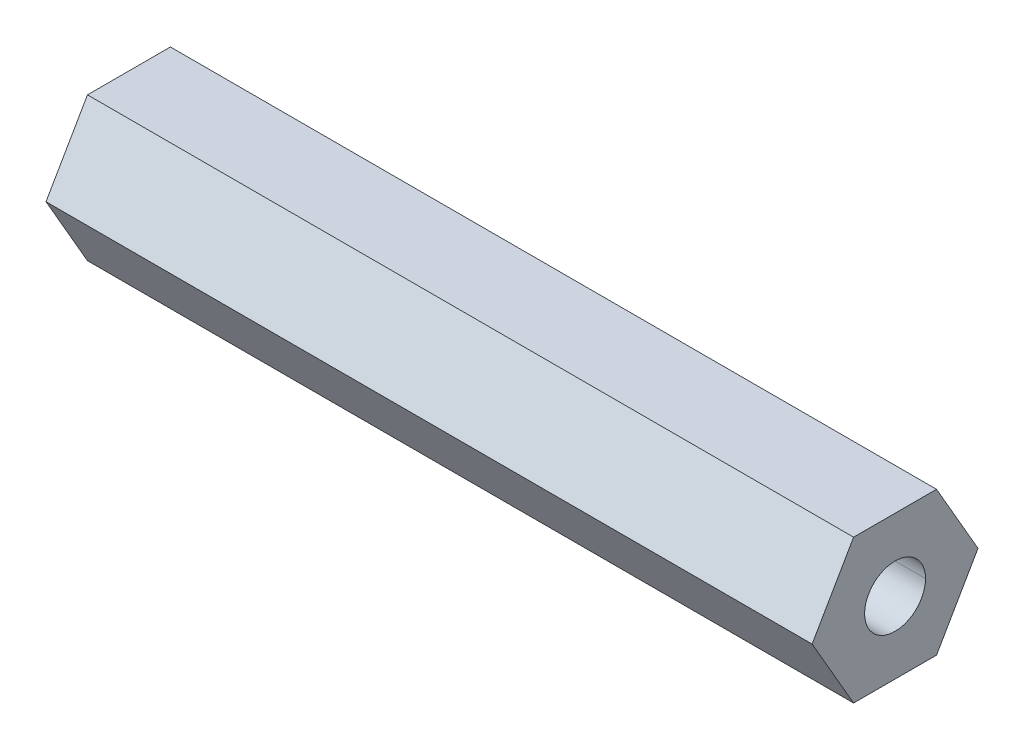
ISO-10303-21;
HEADER;
FILE_DESCRIPTION(('STEP AP214'),'2;1');
FILE_NAME('part.step','',(''),(''),'','','');
FILE_SCHEMA(('AUTOMOTIVE_DESIGN { 1 0 10303 214 1 1 1 1 }'));
ENDSEC;
DATA;
#1=APPLICATION_CONTEXT('core data for automotive mechanical design processes');
#2=APPLICATION_PROTOCOL_DEFINITION('international standard','automotive_design',2000,#1);
#3=PRODUCT_CONTEXT('',#1,'mechanical');
#4=PRODUCT('Part','Part','',(#3));
#5=PRODUCT_RELATED_PRODUCT_CATEGORY('part','',(#4));
#6=PRODUCT_DEFINITION_FORMATION('','',#4);
#7=PRODUCT_DEFINITION_CONTEXT('part definition',#1,'design');
#8=PRODUCT_DEFINITION('design','',#6,#7);
#9=PRODUCT_DEFINITION_SHAPE('','',#8);
#10=(LENGTH_UNIT() NAMED_UNIT(*) SI_UNIT(.MILLI.,.METRE.));
#11=(NAMED_UNIT(*) PLANE_ANGLE_UNIT() SI_UNIT($,.RADIAN.));
#12=(NAMED_UNIT(*) SI_UNIT($,.STERADIAN.) SOLID_ANGLE_UNIT());
#13=UNCERTAINTY_MEASURE_WITH_UNIT(LENGTH_MEASURE(1.E-05),#10,'distance_accuracy_value','');
#14=(GEOMETRIC_REPRESENTATION_CONTEXT(3) GLOBAL_UNCERTAINTY_ASSIGNED_CONTEXT((#13)) GLOBAL_UNIT_ASSIGNED_CONTEXT((#10,
#11,#12)) REPRESENTATION_CONTEXT('',''));
#15=CARTESIAN_POINT('',(0.,0.,0.));
#16=DIRECTION('',(0.,0.,1.));
#17=DIRECTION('',(1.,0.,0.));
#18=AXIS2_PLACEMENT_3D('',#15,#16,#17);
#19=CARTESIAN_POINT('',(25.4,0.,0.));
#20=DIRECTION('',(1.,0.,0.));
#21=DIRECTION('',(0.,0.,-1.));
#22=AXIS2_PLACEMENT_3D('',#19,#20,#21);
#23=CYLINDRICAL_SURFACE('',#22,2.0193);
#24=DIRECTION('',(1.,0.,0.));
#25=VECTOR('',#24,1.);
#26=CARTESIAN_POINT('',(25.4,0.,2.0193));
#27=LINE('',#26,#25);
#28=CARTESIAN_POINT('',(-25.4,0.,2.0193));
#29=VERTEX_POINT('',#28);
#30=CARTESIAN_POINT('',(25.4,0.,2.0193));
#31=VERTEX_POINT('',#30);
#32=EDGE_CURVE('E132',#29,#31,#27,.T.);
#33=ORIENTED_EDGE('',*,*,#32,.F.);
#34=CARTESIAN_POINT('',(-25.4,0.,0.));
#35=DIRECTION('',(1.,0.,0.));
#36=DIRECTION('',(0.,0.,-1.));
#37=AXIS2_PLACEMENT_3D('',#34,#35,#36);
#38=CIRCLE('',#37,2.0193);
#39=CARTESIAN_POINT('',(-25.4,0.,-2.0193));
#40=VERTEX_POINT('',#39);
#41=EDGE_CURVE('E174',#40,#29,#38,.T.);
#42=ORIENTED_EDGE('',*,*,#41,.F.);
#43=DIRECTION('',(1.,0.,0.));
#44=VECTOR('',#43,1.);
#45=CARTESIAN_POINT('',(25.4,0.,-2.0193));
#46=LINE('',#45,#44);
#47=CARTESIAN_POINT('',(25.4,0.,-2.0193));
#48=VERTEX_POINT('',#47);
#49=EDGE_CURVE('E19',#40,#48,#46,.T.);
#50=ORIENTED_EDGE('',*,*,#49,.T.);
#51=CARTESIAN_POINT('',(25.4,0.,0.));
#52=DIRECTION('',(1.,0.,0.));
#53=DIRECTION('',(0.,0.,-1.));
#54=AXIS2_PLACEMENT_3D('',#51,#52,#53);
#55=CIRCLE('',#54,2.0193);
#56=EDGE_CURVE('E122',#48,#31,#55,.T.);
#57=ORIENTED_EDGE('',*,*,#56,.T.);
#58=EDGE_LOOP('',(#33,#42,#50,#57));
#59=FACE_BOUND('',#58,.T.);
#60=ADVANCED_FACE('F16',(#59),#23,.F.);
#61=CARTESIAN_POINT('',(25.4,-4.7625,2.74963065701554));
#62=DIRECTION('',(0.,1.,0.));
#63=DIRECTION('',(0.,0.,-1.));
#64=AXIS2_PLACEMENT_3D('',#61,#62,#63);
#65=PLANE('',#64);
#66=DIRECTION('',(0.,0.,-1.));
#67=VECTOR('',#66,1.);
#68=CARTESIAN_POINT('',(-25.4,-4.7625,2.74963065701554));
#69=LINE('',#68,#67);
#70=CARTESIAN_POINT('',(-25.4,-4.7625,2.74963065701554));
#71=VERTEX_POINT('',#70);
#72=CARTESIAN_POINT('',(-25.4,-4.7625,-2.74963065701564));
#73=VERTEX_POINT('',#72);
#74=EDGE_CURVE('E99',#71,#73,#69,.T.);
#75=ORIENTED_EDGE('',*,*,#74,.T.);
#76=DIRECTION('',(-1.,0.,0.));
#77=VECTOR('',#76,1.);
#78=CARTESIAN_POINT('',(25.4,-4.7625,-2.74963065701564));
#79=LINE('',#78,#77);
#80=CARTESIAN_POINT('',(25.4,-4.7625,-2.74963065701564));
#81=VERTEX_POINT('',#80);
#82=EDGE_CURVE('E61',#81,#73,#79,.T.);
#83=ORIENTED_EDGE('',*,*,#82,.F.);
#84=DIRECTION('',(0.,0.,-1.));
#85=VECTOR('',#84,1.);
#86=CARTESIAN_POINT('',(25.4,-4.7625,2.74963065701554));
#87=LINE('',#86,#85);
#88=CARTESIAN_POINT('',(25.4,-4.7625,2.74963065701554));
#89=VERTEX_POINT('',#88);
#90=EDGE_CURVE('E102',#89,#81,#87,.T.);
#91=ORIENTED_EDGE('',*,*,#90,.F.);
#92=DIRECTION('',(-1.,0.,0.));
#93=VECTOR('',#92,1.);
#94=CARTESIAN_POINT('',(25.4,-4.7625,2.74963065701554));
#95=LINE('',#94,#93);
#96=EDGE_CURVE('E11',#89,#71,#95,.T.);
#97=ORIENTED_EDGE('',*,*,#96,.T.);
#98=EDGE_LOOP('',(#75,#83,#91,#97));
#99=FACE_BOUND('',#98,.T.);
#100=ADVANCED_FACE('F97',(#99),#65,.F.);
#101=CARTESIAN_POINT('',(25.4,0.,5.49926131403117));
#102=DIRECTION('',(0.,0.500000000000007,-0.866025403784435));
#103=DIRECTION('',(-1.,0.,0.));
#104=AXIS2_PLACEMENT_3D('',#101,#102,#103);
#105=PLANE('',#104);
#106=DIRECTION('',(0.,-0.866025403784435,-0.500000000000007));
#107=VECTOR('',#106,1.);
#108=CARTESIAN_POINT('',(-25.4,0.,5.49926131403117));
#109=LINE('',#108,#107);
#110=CARTESIAN_POINT('',(-25.4,0.,5.49926131403117));
#111=VERTEX_POINT('',#110);
#112=EDGE_CURVE('E105',#111,#71,#109,.T.);
#113=ORIENTED_EDGE('',*,*,#112,.T.);
#114=ORIENTED_EDGE('',*,*,#96,.F.);
#115=DIRECTION('',(0.,-0.866025403784435,-0.500000000000007));
#116=VECTOR('',#115,1.);
#117=CARTESIAN_POINT('',(25.4,0.,5.49926131403117));
#118=LINE('',#117,#116);
#119=CARTESIAN_POINT('',(25.4,0.,5.49926131403117));
#120=VERTEX_POINT('',#119);
#121=EDGE_CURVE('E148',#120,#89,#118,.T.);
#122=ORIENTED_EDGE('',*,*,#121,.F.);
#123=DIRECTION('',(-1.,0.,0.));
#124=VECTOR('',#123,1.);
#125=CARTESIAN_POINT('',(25.4,0.,5.49926131403117));
#126=LINE('',#125,#124);
#127=EDGE_CURVE('E26',#120,#111,#126,.T.);
#128=ORIENTED_EDGE('',*,*,#127,.T.);
#129=EDGE_LOOP('',(#113,#114,#122,#128));
#130=FACE_BOUND('',#129,.T.);
#131=ADVANCED_FACE('F106',(#130),#105,.F.);
#132=CARTESIAN_POINT('',(25.4,4.7625,2.7496306570156));
#133=DIRECTION('',(0.,-0.5,-0.866025403784442));
#134=DIRECTION('',(0.,-0.866025403784442,0.5));
#135=AXIS2_PLACEMENT_3D('',#132,#133,#134);
#136=PLANE('',#135);
#137=DIRECTION('',(0.,-0.866025403784442,0.5));
#138=VECTOR('',#137,1.);
#139=CARTESIAN_POINT('',(-25.4,4.7625,2.7496306570156));
#140=LINE('',#139,#138);
#141=CARTESIAN_POINT('',(-25.4,4.7625,2.7496306570156));
#142=VERTEX_POINT('',#141);
#143=EDGE_CURVE('E111',#142,#111,#140,.T.);
#144=ORIENTED_EDGE('',*,*,#143,.T.);
#145=ORIENTED_EDGE('',*,*,#127,.F.);
#146=DIRECTION('',(0.,-0.866025403784442,0.5));
#147=VECTOR('',#146,1.);
#148=CARTESIAN_POINT('',(25.4,4.7625,2.7496306570156));
#149=LINE('',#148,#147);
#150=CARTESIAN_POINT('',(25.4,4.7625,2.7496306570156));
#151=VERTEX_POINT('',#150);
#152=EDGE_CURVE('E156',#151,#120,#149,.T.);
#153=ORIENTED_EDGE('',*,*,#152,.F.);
#154=DIRECTION('',(-1.,0.,0.));
#155=VECTOR('',#154,1.);
#156=CARTESIAN_POINT('',(25.4,4.7625,2.7496306570156));
#157=LINE('',#156,#155);
#158=EDGE_CURVE('E133',#151,#142,#157,.T.);
#159=ORIENTED_EDGE('',*,*,#158,.T.);
#160=EDGE_LOOP('',(#144,#145,#153,#159));
#161=FACE_BOUND('',#160,.T.);
#162=ADVANCED_FACE('F197',(#161),#136,.F.);
#163=CARTESIAN_POINT('',(25.4,4.7625,-2.74963065701557));
#164=DIRECTION('',(0.,-1.,0.));
#165=DIRECTION('',(0.,0.,-1.));
#166=AXIS2_PLACEMENT_3D('',#163,#164,#165);
#167=PLANE('',#166);
#168=DIRECTION('',(0.,0.,1.));
#169=VECTOR('',#168,1.);
#170=CARTESIAN_POINT('',(-25.4,4.7625,-2.74963065701557));
#171=LINE('',#170,#169);
#172=CARTESIAN_POINT('',(-25.4,4.7625,-2.74963065701557));
#173=VERTEX_POINT('',#172);
#174=EDGE_CURVE('E170',#173,#142,#171,.T.);
#175=ORIENTED_EDGE('',*,*,#174,.T.);
#176=ORIENTED_EDGE('',*,*,#158,.F.);
#177=DIRECTION('',(0.,0.,1.));
#178=VECTOR('',#177,1.);
#179=CARTESIAN_POINT('',(25.4,4.7625,-2.74963065701557));
#180=LINE('',#179,#178);
#181=CARTESIAN_POINT('',(25.4,4.7625,-2.74963065701557));
#182=VERTEX_POINT('',#181);
#183=EDGE_CURVE('E160',#182,#151,#180,.T.);
#184=ORIENTED_EDGE('',*,*,#183,.F.);
#185=DIRECTION('',(-1.,0.,0.));
#186=VECTOR('',#185,1.);
#187=CARTESIAN_POINT('',(25.4,4.7625,-2.74963065701557));
#188=LINE('',#187,#186);
#189=EDGE_CURVE('E41',#182,#173,#188,.T.);
#190=ORIENTED_EDGE('',*,*,#189,.T.);
#191=EDGE_LOOP('',(#175,#176,#184,#190));
#192=FACE_BOUND('',#191,.T.);
#193=ADVANCED_FACE('F194',(#192),#167,.F.);
#194=CARTESIAN_POINT('',(25.4,0.,-5.49926131403117));
#195=DIRECTION('',(0.,-0.5,0.866025403784438));
#196=DIRECTION('',(-1.,0.,0.));
#197=AXIS2_PLACEMENT_3D('',#194,#195,#196);
#198=PLANE('',#197);
#199=DIRECTION('',(0.,0.866025403784438,0.5));
#200=VECTOR('',#199,1.);
#201=CARTESIAN_POINT('',(-25.4,0.,-5.49926131403117));
#202=LINE('',#201,#200);
#203=CARTESIAN_POINT('',(-25.4,0.,-5.49926131403117));
#204=VERTEX_POINT('',#203);
#205=EDGE_CURVE('E171',#204,#173,#202,.T.);
#206=ORIENTED_EDGE('',*,*,#205,.T.);
#207=ORIENTED_EDGE('',*,*,#189,.F.);
#208=DIRECTION('',(0.,0.866025403784438,0.5));
#209=VECTOR('',#208,1.);
#210=CARTESIAN_POINT('',(25.4,0.,-5.49926131403117));
#211=LINE('',#210,#209);
#212=CARTESIAN_POINT('',(25.4,0.,-5.49926131403117));
#213=VERTEX_POINT('',#212);
#214=EDGE_CURVE('E178',#213,#182,#211,.T.);
#215=ORIENTED_EDGE('',*,*,#214,.F.);
#216=DIRECTION('',(-1.,0.,0.));
#217=VECTOR('',#216,1.);
#218=CARTESIAN_POINT('',(25.4,0.,-5.49926131403117));
#219=LINE('',#218,#217);
#220=EDGE_CURVE('E176',#213,#204,#219,.T.);
#221=ORIENTED_EDGE('',*,*,#220,.T.);
#222=EDGE_LOOP('',(#206,#207,#215,#221));
#223=FACE_BOUND('',#222,.T.);
#224=ADVANCED_FACE('F278',(#223),#198,.F.);
#225=CARTESIAN_POINT('',(25.4,-4.7625,-2.74963065701564));
#226=DIRECTION('',(0.,0.5,0.866025403784442));
#227=DIRECTION('',(1.,0.,0.));
#228=AXIS2_PLACEMENT_3D('',#225,#226,#227);
#229=PLANE('',#228);
#230=DIRECTION('',(0.,0.866025403784442,-0.5));
#231=VECTOR('',#230,1.);
#232=CARTESIAN_POINT('',(-25.4,-4.7625,-2.74963065701564));
#233=LINE('',#232,#231);
#234=EDGE_CURVE('E115',#73,#204,#233,.T.);
#235=ORIENTED_EDGE('',*,*,#234,.T.);
#236=ORIENTED_EDGE('',*,*,#220,.F.);
#237=DIRECTION('',(0.,0.866025403784442,-0.5));
#238=VECTOR('',#237,1.);
#239=CARTESIAN_POINT('',(25.4,-4.7625,-2.74963065701564));
#240=LINE('',#239,#238);
#241=EDGE_CURVE('E126',#81,#213,#240,.T.);
#242=ORIENTED_EDGE('',*,*,#241,.F.);
#243=ORIENTED_EDGE('',*,*,#82,.T.);
#244=EDGE_LOOP('',(#235,#236,#242,#243));
#245=FACE_BOUND('',#244,.T.);
#246=ADVANCED_FACE('F267',(#245),#229,.F.);
#247=CARTESIAN_POINT('',(-25.4,0.,0.));
#248=DIRECTION('',(1.,0.,0.));
#249=DIRECTION('',(0.,1.,0.));
#250=AXIS2_PLACEMENT_3D('',#247,#248,#249);
#251=PLANE('',#250);
#252=ORIENTED_EDGE('',*,*,#41,.T.);
#253=CARTESIAN_POINT('',(-25.4,0.,0.));
#254=DIRECTION('',(1.,0.,0.));
#255=DIRECTION('',(0.,0.,-1.));
#256=AXIS2_PLACEMENT_3D('',#253,#254,#255);
#257=CIRCLE('',#256,2.0193);
#258=EDGE_CURVE('E128',#29,#40,#257,.T.);
#259=ORIENTED_EDGE('',*,*,#258,.T.);
#260=EDGE_LOOP('',(#252,#259));
#261=FACE_BOUND('',#260,.T.);
#262=ORIENTED_EDGE('',*,*,#234,.F.);
#263=ORIENTED_EDGE('',*,*,#74,.F.);
#264=ORIENTED_EDGE('',*,*,#112,.F.);
#265=ORIENTED_EDGE('',*,*,#143,.F.);
#266=ORIENTED_EDGE('',*,*,#174,.F.);
#267=ORIENTED_EDGE('',*,*,#205,.F.);
#268=EDGE_LOOP('',(#262,#263,#264,#265,#266,#267));
#269=FACE_BOUND('',#268,.T.);
#270=ADVANCED_FACE('F113',(#261,#269),#251,.F.);
#271=CARTESIAN_POINT('',(25.4,0.,0.));
#272=DIRECTION('',(1.,0.,0.));
#273=DIRECTION('',(0.,1.,0.));
#274=AXIS2_PLACEMENT_3D('',#271,#272,#273);
#275=PLANE('',#274);
#276=ORIENTED_EDGE('',*,*,#56,.F.);
#277=CARTESIAN_POINT('',(25.4,0.,0.));
#278=DIRECTION('',(1.,0.,0.));
#279=DIRECTION('',(0.,0.,-1.));
#280=AXIS2_PLACEMENT_3D('',#277,#278,#279);
#281=CIRCLE('',#280,2.0193);
#282=EDGE_CURVE('E164',#31,#48,#281,.T.);
#283=ORIENTED_EDGE('',*,*,#282,.F.);
#284=EDGE_LOOP('',(#276,#283));
#285=FACE_BOUND('',#284,.T.);
#286=ORIENTED_EDGE('',*,*,#241,.T.);
#287=ORIENTED_EDGE('',*,*,#214,.T.);
#288=ORIENTED_EDGE('',*,*,#183,.T.);
#289=ORIENTED_EDGE('',*,*,#152,.T.);
#290=ORIENTED_EDGE('',*,*,#121,.T.);
#291=ORIENTED_EDGE('',*,*,#90,.T.);
#292=EDGE_LOOP('',(#286,#287,#288,#289,#290,#291));
#293=FACE_BOUND('',#292,.T.);
#294=ADVANCED_FACE('F199',(#285,#293),#275,.T.);
#295=CARTESIAN_POINT('',(25.4,0.,0.));
#296=DIRECTION('',(1.,0.,0.));
#297=DIRECTION('',(0.,0.,-1.));
#298=AXIS2_PLACEMENT_3D('',#295,#296,#297);
#299=CYLINDRICAL_SURFACE('',#298,2.0193);
#300=ORIENTED_EDGE('',*,*,#258,.F.);
#301=ORIENTED_EDGE('',*,*,#32,.T.);
#302=ORIENTED_EDGE('',*,*,#282,.T.);
#303=ORIENTED_EDGE('',*,*,#49,.F.);
#304=EDGE_LOOP('',(#300,#301,#302,#303));
#305=FACE_BOUND('',#304,.T.);
#306=ADVANCED_FACE('F297',(#305),#299,.F.);
#307=CLOSED_SHELL('',(#60,#100,#131,#162,#193,#224,#246,#270,#294,#306));
#308=MANIFOLD_SOLID_BREP('B1',#307);
#309=ADVANCED_BREP_SHAPE_REPRESENTATION('',(#18,#308),#14);
#310=SHAPE_DEFINITION_REPRESENTATION(#9,#309);
ENDSEC;
END-ISO-10303-21;
